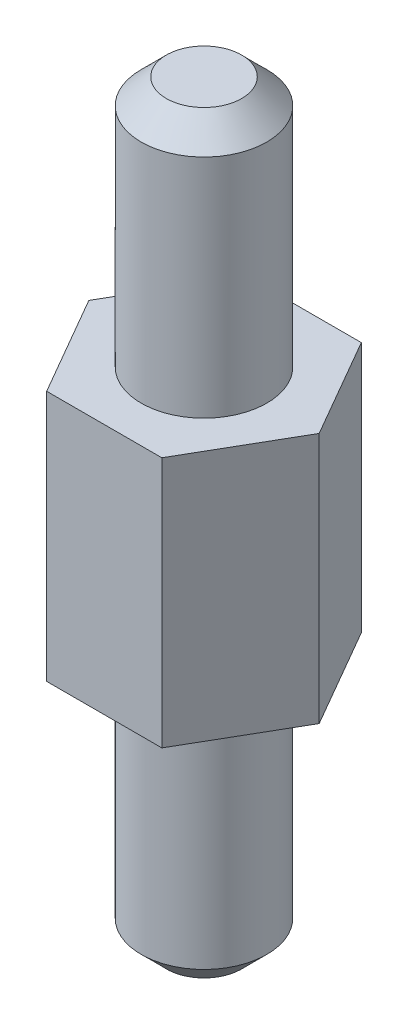
ISO-10303-21;
HEADER;
FILE_DESCRIPTION(('STEP AP214'),'2;1');
FILE_NAME('part.step','',(''),(''),'','','');
FILE_SCHEMA(('AUTOMOTIVE_DESIGN { 1 0 10303 214 1 1 1 1 }'));
ENDSEC;
DATA;
#1=APPLICATION_CONTEXT('core data for automotive mechanical design processes');
#2=APPLICATION_PROTOCOL_DEFINITION('international standard','automotive_design',2000,#1);
#3=PRODUCT_CONTEXT('',#1,'mechanical');
#4=PRODUCT('Part','Part','',(#3));
#5=PRODUCT_RELATED_PRODUCT_CATEGORY('part','',(#4));
#6=PRODUCT_DEFINITION_FORMATION('','',#4);
#7=PRODUCT_DEFINITION_CONTEXT('part definition',#1,'design');
#8=PRODUCT_DEFINITION('design','',#6,#7);
#9=PRODUCT_DEFINITION_SHAPE('','',#8);
#10=(LENGTH_UNIT() NAMED_UNIT(*) SI_UNIT(.MILLI.,.METRE.));
#11=(NAMED_UNIT(*) PLANE_ANGLE_UNIT() SI_UNIT($,.RADIAN.));
#12=(NAMED_UNIT(*) SI_UNIT($,.STERADIAN.) SOLID_ANGLE_UNIT());
#13=UNCERTAINTY_MEASURE_WITH_UNIT(LENGTH_MEASURE(1.E-05),#10,'distance_accuracy_value','');
#14=(GEOMETRIC_REPRESENTATION_CONTEXT(3) GLOBAL_UNCERTAINTY_ASSIGNED_CONTEXT((#13)) GLOBAL_UNIT_ASSIGNED_CONTEXT((#10,
#11,#12)) REPRESENTATION_CONTEXT('',''));
#15=CARTESIAN_POINT('',(0.,0.,0.));
#16=DIRECTION('',(0.,0.,1.));
#17=DIRECTION('',(1.,0.,0.));
#18=AXIS2_PLACEMENT_3D('',#15,#16,#17);
#19=CARTESIAN_POINT('',(2.75,6.,0.));
#20=DIRECTION('',(-0.86602540378444,0.,-0.499999999999998));
#21=DIRECTION('',(-0.499999999999998,0.,0.86602540378444));
#22=AXIS2_PLACEMENT_3D('',#19,#20,#21);
#23=PLANE('',#22);
#24=DIRECTION('',(0.499999999999998,0.,-0.86602540378444));
#25=VECTOR('',#24,1.);
#26=CARTESIAN_POINT('',(2.75,0.,0.));
#27=LINE('',#26,#25);
#28=CARTESIAN_POINT('',(1.37500000000001,0.,2.3815698604072));
#29=VERTEX_POINT('',#28);
#30=CARTESIAN_POINT('',(2.75,0.,0.));
#31=VERTEX_POINT('',#30);
#32=EDGE_CURVE('E119',#29,#31,#27,.T.);
#33=ORIENTED_EDGE('',*,*,#32,.T.);
#34=DIRECTION('',(0.,-1.,0.));
#35=VECTOR('',#34,1.);
#36=CARTESIAN_POINT('',(2.75,6.,0.));
#37=LINE('',#36,#35);
#38=CARTESIAN_POINT('',(2.75,6.,0.));
#39=VERTEX_POINT('',#38);
#40=EDGE_CURVE('E137',#39,#31,#37,.T.);
#41=ORIENTED_EDGE('',*,*,#40,.F.);
#42=DIRECTION('',(0.499999999999998,0.,-0.86602540378444));
#43=VECTOR('',#42,1.);
#44=CARTESIAN_POINT('',(2.75,6.,0.));
#45=LINE('',#44,#43);
#46=CARTESIAN_POINT('',(1.37500000000001,6.,2.3815698604072));
#47=VERTEX_POINT('',#46);
#48=EDGE_CURVE('E130',#47,#39,#45,.T.);
#49=ORIENTED_EDGE('',*,*,#48,.F.);
#50=DIRECTION('',(0.,-1.,0.));
#51=VECTOR('',#50,1.);
#52=CARTESIAN_POINT('',(1.37500000000001,6.,2.3815698604072));
#53=LINE('',#52,#51);
#54=EDGE_CURVE('E115',#47,#29,#53,.T.);
#55=ORIENTED_EDGE('',*,*,#54,.T.);
#56=EDGE_LOOP('',(#33,#41,#49,#55));
#57=FACE_BOUND('',#56,.T.);
#58=ADVANCED_FACE('F33',(#57),#23,.F.);
#59=CARTESIAN_POINT('',(1.37499999999999,6.,-2.38156986040721));
#60=DIRECTION('',(-0.866025403784438,0.,0.500000000000001));
#61=DIRECTION('',(0.500000000000001,0.,0.866025403784438));
#62=AXIS2_PLACEMENT_3D('',#59,#60,#61);
#63=PLANE('',#62);
#64=DIRECTION('',(-0.500000000000001,0.,-0.866025403784438));
#65=VECTOR('',#64,1.);
#66=CARTESIAN_POINT('',(1.37499999999999,0.,-2.38156986040721));
#67=LINE('',#66,#65);
#68=CARTESIAN_POINT('',(1.37499999999999,0.,-2.38156986040721));
#69=VERTEX_POINT('',#68);
#70=EDGE_CURVE('E122',#31,#69,#67,.T.);
#71=ORIENTED_EDGE('',*,*,#70,.T.);
#72=DIRECTION('',(0.,-1.,0.));
#73=VECTOR('',#72,1.);
#74=CARTESIAN_POINT('',(1.37499999999999,6.,-2.38156986040721));
#75=LINE('',#74,#73);
#76=CARTESIAN_POINT('',(1.37499999999999,6.,-2.38156986040721));
#77=VERTEX_POINT('',#76);
#78=EDGE_CURVE('E134',#77,#69,#75,.T.);
#79=ORIENTED_EDGE('',*,*,#78,.F.);
#80=DIRECTION('',(-0.500000000000001,0.,-0.866025403784438));
#81=VECTOR('',#80,1.);
#82=CARTESIAN_POINT('',(1.37499999999999,6.,-2.38156986040721));
#83=LINE('',#82,#81);
#84=EDGE_CURVE('E88',#39,#77,#83,.T.);
#85=ORIENTED_EDGE('',*,*,#84,.F.);
#86=ORIENTED_EDGE('',*,*,#40,.T.);
#87=EDGE_LOOP('',(#71,#79,#85,#86));
#88=FACE_BOUND('',#87,.T.);
#89=ADVANCED_FACE('F161',(#88),#63,.F.);
#90=CARTESIAN_POINT('',(-1.37500000000001,6.,-2.3815698604072));
#91=DIRECTION('',(0.,0.,1.));
#92=DIRECTION('',(1.,0.,0.));
#93=AXIS2_PLACEMENT_3D('',#90,#91,#92);
#94=PLANE('',#93);
#95=DIRECTION('',(-1.,0.,0.));
#96=VECTOR('',#95,1.);
#97=CARTESIAN_POINT('',(-1.37500000000001,0.,-2.3815698604072));
#98=LINE('',#97,#96);
#99=CARTESIAN_POINT('',(-1.37500000000001,0.,-2.3815698604072));
#100=VERTEX_POINT('',#99);
#101=EDGE_CURVE('E125',#69,#100,#98,.T.);
#102=ORIENTED_EDGE('',*,*,#101,.T.);
#103=DIRECTION('',(0.,-1.,0.));
#104=VECTOR('',#103,1.);
#105=CARTESIAN_POINT('',(-1.37500000000001,6.,-2.3815698604072));
#106=LINE('',#105,#104);
#107=CARTESIAN_POINT('',(-1.37500000000001,6.,-2.3815698604072));
#108=VERTEX_POINT('',#107);
#109=EDGE_CURVE('E110',#108,#100,#106,.T.);
#110=ORIENTED_EDGE('',*,*,#109,.F.);
#111=DIRECTION('',(-1.,0.,0.));
#112=VECTOR('',#111,1.);
#113=CARTESIAN_POINT('',(-1.37500000000001,6.,-2.3815698604072));
#114=LINE('',#113,#112);
#115=EDGE_CURVE('E101',#77,#108,#114,.T.);
#116=ORIENTED_EDGE('',*,*,#115,.F.);
#117=ORIENTED_EDGE('',*,*,#78,.T.);
#118=EDGE_LOOP('',(#102,#110,#116,#117));
#119=FACE_BOUND('',#118,.T.);
#120=ADVANCED_FACE('F167',(#119),#94,.F.);
#121=CARTESIAN_POINT('',(-2.75,6.,0.));
#122=DIRECTION('',(0.86602540378444,0.,0.499999999999998));
#123=DIRECTION('',(0.499999999999998,0.,-0.86602540378444));
#124=AXIS2_PLACEMENT_3D('',#121,#122,#123);
#125=PLANE('',#124);
#126=DIRECTION('',(-0.499999999999998,0.,0.86602540378444));
#127=VECTOR('',#126,1.);
#128=CARTESIAN_POINT('',(-2.75,0.,0.));
#129=LINE('',#128,#127);
#130=CARTESIAN_POINT('',(-2.75,0.,0.));
#131=VERTEX_POINT('',#130);
#132=EDGE_CURVE('E109',#100,#131,#129,.T.);
#133=ORIENTED_EDGE('',*,*,#132,.T.);
#134=DIRECTION('',(0.,-1.,0.));
#135=VECTOR('',#134,1.);
#136=CARTESIAN_POINT('',(-2.75,6.,0.));
#137=LINE('',#136,#135);
#138=CARTESIAN_POINT('',(-2.75,6.,0.));
#139=VERTEX_POINT('',#138);
#140=EDGE_CURVE('E106',#139,#131,#137,.T.);
#141=ORIENTED_EDGE('',*,*,#140,.F.);
#142=DIRECTION('',(-0.499999999999998,0.,0.86602540378444));
#143=VECTOR('',#142,1.);
#144=CARTESIAN_POINT('',(-2.75,6.,0.));
#145=LINE('',#144,#143);
#146=EDGE_CURVE('E95',#108,#139,#145,.T.);
#147=ORIENTED_EDGE('',*,*,#146,.F.);
#148=ORIENTED_EDGE('',*,*,#109,.T.);
#149=EDGE_LOOP('',(#133,#141,#147,#148));
#150=FACE_BOUND('',#149,.T.);
#151=ADVANCED_FACE('F107',(#150),#125,.F.);
#152=CARTESIAN_POINT('',(-1.37499999999999,6.,2.38156986040721));
#153=DIRECTION('',(0.866025403784438,0.,-0.500000000000001));
#154=DIRECTION('',(-0.500000000000001,0.,-0.866025403784438));
#155=AXIS2_PLACEMENT_3D('',#152,#153,#154);
#156=PLANE('',#155);
#157=DIRECTION('',(0.500000000000001,0.,0.866025403784438));
#158=VECTOR('',#157,1.);
#159=CARTESIAN_POINT('',(-1.37499999999999,0.,2.38156986040721));
#160=LINE('',#159,#158);
#161=CARTESIAN_POINT('',(-1.37499999999999,0.,2.38156986040721));
#162=VERTEX_POINT('',#161);
#163=EDGE_CURVE('E73',#131,#162,#160,.T.);
#164=ORIENTED_EDGE('',*,*,#163,.T.);
#165=DIRECTION('',(0.,-1.,0.));
#166=VECTOR('',#165,1.);
#167=CARTESIAN_POINT('',(-1.37499999999999,6.,2.38156986040721));
#168=LINE('',#167,#166);
#169=CARTESIAN_POINT('',(-1.37499999999999,6.,2.38156986040721));
#170=VERTEX_POINT('',#169);
#171=EDGE_CURVE('E111',#170,#162,#168,.T.);
#172=ORIENTED_EDGE('',*,*,#171,.F.);
#173=DIRECTION('',(0.500000000000001,0.,0.866025403784438));
#174=VECTOR('',#173,1.);
#175=CARTESIAN_POINT('',(-1.37499999999999,6.,2.38156986040721));
#176=LINE('',#175,#174);
#177=EDGE_CURVE('E99',#139,#170,#176,.T.);
#178=ORIENTED_EDGE('',*,*,#177,.F.);
#179=ORIENTED_EDGE('',*,*,#140,.T.);
#180=EDGE_LOOP('',(#164,#172,#178,#179));
#181=FACE_BOUND('',#180,.T.);
#182=ADVANCED_FACE('F113',(#181),#156,.F.);
#183=CARTESIAN_POINT('',(1.37500000000001,6.,2.3815698604072));
#184=DIRECTION('',(0.,0.,-1.));
#185=DIRECTION('',(-1.,0.,0.));
#186=AXIS2_PLACEMENT_3D('',#183,#184,#185);
#187=PLANE('',#186);
#188=DIRECTION('',(1.,0.,0.));
#189=VECTOR('',#188,1.);
#190=CARTESIAN_POINT('',(1.37500000000001,0.,2.3815698604072));
#191=LINE('',#190,#189);
#192=EDGE_CURVE('E79',#162,#29,#191,.T.);
#193=ORIENTED_EDGE('',*,*,#192,.T.);
#194=ORIENTED_EDGE('',*,*,#54,.F.);
#195=DIRECTION('',(1.,0.,0.));
#196=VECTOR('',#195,1.);
#197=CARTESIAN_POINT('',(1.37500000000001,6.,2.3815698604072));
#198=LINE('',#197,#196);
#199=EDGE_CURVE('E50',#170,#47,#198,.T.);
#200=ORIENTED_EDGE('',*,*,#199,.F.);
#201=ORIENTED_EDGE('',*,*,#171,.T.);
#202=EDGE_LOOP('',(#193,#194,#200,#201));
#203=FACE_BOUND('',#202,.T.);
#204=ADVANCED_FACE('F177',(#203),#187,.F.);
#205=CARTESIAN_POINT('',(0.,6.,0.));
#206=DIRECTION('',(0.,-1.,0.));
#207=DIRECTION('',(0.,0.,-1.));
#208=AXIS2_PLACEMENT_3D('',#205,#206,#207);
#209=PLANE('',#208);
#210=CARTESIAN_POINT('',(0.,6.,0.));
#211=DIRECTION('',(0.,-1.,0.));
#212=DIRECTION('',(0.,0.,-1.));
#213=AXIS2_PLACEMENT_3D('',#210,#211,#212);
#214=CIRCLE('',#213,1.5);
#215=CARTESIAN_POINT('',(0.,6.,-1.5));
#216=VERTEX_POINT('',#215);
#217=EDGE_CURVE('E139',#216,#216,#214,.F.);
#218=ORIENTED_EDGE('',*,*,#217,.F.);
#219=EDGE_LOOP('',(#218));
#220=FACE_BOUND('',#219,.T.);
#221=ORIENTED_EDGE('',*,*,#48,.T.);
#222=ORIENTED_EDGE('',*,*,#84,.T.);
#223=ORIENTED_EDGE('',*,*,#115,.T.);
#224=ORIENTED_EDGE('',*,*,#146,.T.);
#225=ORIENTED_EDGE('',*,*,#177,.T.);
#226=ORIENTED_EDGE('',*,*,#199,.T.);
#227=EDGE_LOOP('',(#221,#222,#223,#224,#225,#226));
#228=FACE_BOUND('',#227,.T.);
#229=ADVANCED_FACE('F97',(#220,#228),#209,.F.);
#230=CARTESIAN_POINT('',(0.,0.,0.));
#231=DIRECTION('',(0.,-1.,0.));
#232=DIRECTION('',(0.,0.,-1.));
#233=AXIS2_PLACEMENT_3D('',#230,#231,#232);
#234=PLANE('',#233);
#235=CARTESIAN_POINT('',(0.,0.,0.));
#236=DIRECTION('',(0.,-1.,0.));
#237=DIRECTION('',(0.,0.,-1.));
#238=AXIS2_PLACEMENT_3D('',#235,#236,#237);
#239=CIRCLE('',#238,1.5);
#240=CARTESIAN_POINT('',(0.,0.,-1.5));
#241=VERTEX_POINT('',#240);
#242=EDGE_CURVE('E123',#241,#241,#239,.T.);
#243=ORIENTED_EDGE('',*,*,#242,.F.);
#244=EDGE_LOOP('',(#243));
#245=FACE_BOUND('',#244,.T.);
#246=ORIENTED_EDGE('',*,*,#32,.F.);
#247=ORIENTED_EDGE('',*,*,#192,.F.);
#248=ORIENTED_EDGE('',*,*,#163,.F.);
#249=ORIENTED_EDGE('',*,*,#132,.F.);
#250=ORIENTED_EDGE('',*,*,#101,.F.);
#251=ORIENTED_EDGE('',*,*,#70,.F.);
#252=EDGE_LOOP('',(#246,#247,#248,#249,#250,#251));
#253=FACE_BOUND('',#252,.T.);
#254=ADVANCED_FACE('F180',(#245,#253),#234,.T.);
#255=CARTESIAN_POINT('',(0.,12.,0.));
#256=DIRECTION('',(0.,-1.,0.));
#257=DIRECTION('',(0.,0.,-1.));
#258=AXIS2_PLACEMENT_3D('',#255,#256,#257);
#259=CYLINDRICAL_SURFACE('',#258,1.5);
#260=CARTESIAN_POINT('',(0.,11.4,0.));
#261=DIRECTION('',(0.,1.,0.));
#262=DIRECTION('',(0.,0.,1.));
#263=AXIS2_PLACEMENT_3D('',#260,#261,#262);
#264=CIRCLE('',#263,1.5);
#265=CARTESIAN_POINT('',(0.,11.4,1.5));
#266=VERTEX_POINT('',#265);
#267=EDGE_CURVE('E145',#266,#266,#264,.F.);
#268=ORIENTED_EDGE('',*,*,#267,.T.);
#269=EDGE_LOOP('',(#268));
#270=FACE_BOUND('',#269,.T.);
#271=ORIENTED_EDGE('',*,*,#217,.T.);
#272=EDGE_LOOP('',(#271));
#273=FACE_BOUND('',#272,.T.);
#274=ADVANCED_FACE('F183',(#270,#273),#259,.T.);
#275=CARTESIAN_POINT('',(0.,12.,0.));
#276=DIRECTION('',(0.,1.,0.));
#277=DIRECTION('',(0.,0.,1.));
#278=AXIS2_PLACEMENT_3D('',#275,#276,#277);
#279=PLANE('',#278);
#280=CARTESIAN_POINT('',(0.,12.,0.));
#281=DIRECTION('',(0.,1.,0.));
#282=DIRECTION('',(0.,0.,1.));
#283=AXIS2_PLACEMENT_3D('',#280,#281,#282);
#284=CIRCLE('',#283,0.900000000000001);
#285=CARTESIAN_POINT('',(0.,12.,0.900000000000001));
#286=VERTEX_POINT('',#285);
#287=EDGE_CURVE('E142',#286,#286,#284,.T.);
#288=ORIENTED_EDGE('',*,*,#287,.T.);
#289=EDGE_LOOP('',(#288));
#290=FACE_BOUND('',#289,.T.);
#291=ADVANCED_FACE('F190',(#290),#279,.T.);
#292=CARTESIAN_POINT('',(0.,-6.,0.));
#293=DIRECTION('',(0.,1.,0.));
#294=DIRECTION('',(0.,0.,1.));
#295=AXIS2_PLACEMENT_3D('',#292,#293,#294);
#296=CYLINDRICAL_SURFACE('',#295,1.5);
#297=CARTESIAN_POINT('',(0.,-5.4,0.));
#298=DIRECTION('',(0.,-1.,0.));
#299=DIRECTION('',(0.,0.,-1.));
#300=AXIS2_PLACEMENT_3D('',#297,#298,#299);
#301=CIRCLE('',#300,1.5);
#302=CARTESIAN_POINT('',(0.,-5.4,-1.5));
#303=VERTEX_POINT('',#302);
#304=EDGE_CURVE('E11',#303,#303,#301,.F.);
#305=ORIENTED_EDGE('',*,*,#304,.T.);
#306=EDGE_LOOP('',(#305));
#307=FACE_BOUND('',#306,.T.);
#308=ORIENTED_EDGE('',*,*,#242,.T.);
#309=EDGE_LOOP('',(#308));
#310=FACE_BOUND('',#309,.T.);
#311=ADVANCED_FACE('F194',(#307,#310),#296,.T.);
#312=CARTESIAN_POINT('',(0.,-6.,0.));
#313=DIRECTION('',(0.,-1.,0.));
#314=DIRECTION('',(0.,0.,-1.));
#315=AXIS2_PLACEMENT_3D('',#312,#313,#314);
#316=PLANE('',#315);
#317=CARTESIAN_POINT('',(0.,-6.,0.));
#318=DIRECTION('',(0.,-1.,0.));
#319=DIRECTION('',(0.,0.,-1.));
#320=AXIS2_PLACEMENT_3D('',#317,#318,#319);
#321=CIRCLE('',#320,0.900000000000001);
#322=CARTESIAN_POINT('',(0.,-6.,-0.900000000000001));
#323=VERTEX_POINT('',#322);
#324=EDGE_CURVE('E42',#323,#323,#321,.T.);
#325=ORIENTED_EDGE('',*,*,#324,.T.);
#326=EDGE_LOOP('',(#325));
#327=FACE_BOUND('',#326,.T.);
#328=ADVANCED_FACE('F150',(#327),#316,.T.);
#329=CARTESIAN_POINT('',(0.,12.,0.));
#330=DIRECTION('',(0.,-1.,0.));
#331=DIRECTION('',(0.,0.,-1.));
#332=AXIS2_PLACEMENT_3D('',#329,#330,#331);
#333=CONICAL_SURFACE('',#332,0.900000000000001,0.785398163397447);
#334=ORIENTED_EDGE('',*,*,#267,.F.);
#335=EDGE_LOOP('',(#334));
#336=FACE_BOUND('',#335,.T.);
#337=ORIENTED_EDGE('',*,*,#287,.F.);
#338=EDGE_LOOP('',(#337));
#339=FACE_BOUND('',#338,.T.);
#340=ADVANCED_FACE('F153',(#336,#339),#333,.T.);
#341=CARTESIAN_POINT('',(0.,-6.,0.));
#342=DIRECTION('',(0.,1.,0.));
#343=DIRECTION('',(0.,0.,1.));
#344=AXIS2_PLACEMENT_3D('',#341,#342,#343);
#345=CONICAL_SURFACE('',#344,0.900000000000001,0.785398163397447);
#346=ORIENTED_EDGE('',*,*,#304,.F.);
#347=EDGE_LOOP('',(#346));
#348=FACE_BOUND('',#347,.T.);
#349=ORIENTED_EDGE('',*,*,#324,.F.);
#350=EDGE_LOOP('',(#349));
#351=FACE_BOUND('',#350,.T.);
#352=ADVANCED_FACE('F35',(#348,#351),#345,.T.);
#353=CLOSED_SHELL('',(#58,#89,#120,#151,#182,#204,#229,#254,#274,#291,#311,#328,#340,#352));
#354=MANIFOLD_SOLID_BREP('B2',#353);
#355=ADVANCED_BREP_SHAPE_REPRESENTATION('',(#18,#354),#14);
#356=SHAPE_DEFINITION_REPRESENTATION(#9,#355);
ENDSEC;
END-ISO-10303-21;
